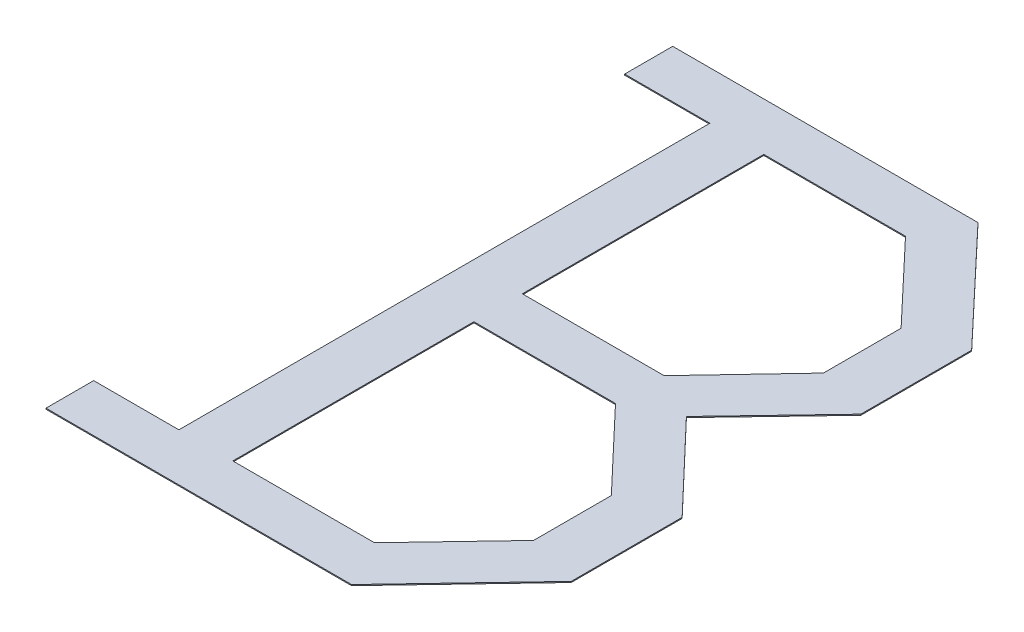
ISO-10303-21;
HEADER;
FILE_DESCRIPTION(('STEP AP214'),'2;1');
FILE_NAME('part.step','',(''),(''),'','','');
FILE_SCHEMA(('AUTOMOTIVE_DESIGN { 1 0 10303 214 1 1 1 1 }'));
ENDSEC;
DATA;
#1=APPLICATION_CONTEXT('core data for automotive mechanical design processes');
#2=APPLICATION_PROTOCOL_DEFINITION('international standard','automotive_design',2000,#1);
#3=PRODUCT_CONTEXT('',#1,'mechanical');
#4=PRODUCT('Part','Part','',(#3));
#5=PRODUCT_RELATED_PRODUCT_CATEGORY('part','',(#4));
#6=PRODUCT_DEFINITION_FORMATION('','',#4);
#7=PRODUCT_DEFINITION_CONTEXT('part definition',#1,'design');
#8=PRODUCT_DEFINITION('design','',#6,#7);
#9=PRODUCT_DEFINITION_SHAPE('','',#8);
#10=(LENGTH_UNIT() NAMED_UNIT(*) SI_UNIT(.MILLI.,.METRE.));
#11=(NAMED_UNIT(*) PLANE_ANGLE_UNIT() SI_UNIT($,.RADIAN.));
#12=(NAMED_UNIT(*) SI_UNIT($,.STERADIAN.) SOLID_ANGLE_UNIT());
#13=UNCERTAINTY_MEASURE_WITH_UNIT(LENGTH_MEASURE(1.E-05),#10,'distance_accuracy_value','');
#14=(GEOMETRIC_REPRESENTATION_CONTEXT(3) GLOBAL_UNCERTAINTY_ASSIGNED_CONTEXT((#13)) GLOBAL_UNIT_ASSIGNED_CONTEXT((#10,
#11,#12)) REPRESENTATION_CONTEXT('',''));
#15=CARTESIAN_POINT('',(0.,0.,0.));
#16=DIRECTION('',(0.,0.,1.));
#17=DIRECTION('',(1.,0.,0.));
#18=AXIS2_PLACEMENT_3D('',#15,#16,#17);
#19=CARTESIAN_POINT('',(0.,1.4,0.));
#20=DIRECTION('',(0.,-1.,0.));
#21=DIRECTION('',(0.,0.,-1.));
#22=AXIS2_PLACEMENT_3D('',#19,#20,#21);
#23=PLANE('',#22);
#24=DIRECTION('',(1.,0.,0.));
#25=VECTOR('',#24,1.);
#26=CARTESIAN_POINT('',(4.48324374001376,1.4,-0.881585544443215));
#27=LINE('',#26,#25);
#28=CARTESIAN_POINT('',(4.34227378124682,1.4,-0.881585544443215));
#29=VERTEX_POINT('',#28);
#30=CARTESIAN_POINT('',(4.48324374001376,1.4,-0.881585544443215));
#31=VERTEX_POINT('',#30);
#32=EDGE_CURVE('E242',#29,#31,#27,.T.);
#33=ORIENTED_EDGE('',*,*,#32,.F.);
#34=DIRECTION('',(0.,0.,-1.));
#35=VECTOR('',#34,1.);
#36=CARTESIAN_POINT('',(4.34227378124682,1.4,-0.881585544443215));
#37=LINE('',#36,#35);
#38=CARTESIAN_POINT('',(4.34227378124682,1.4,-0.641522713106085));
#39=VERTEX_POINT('',#38);
#40=EDGE_CURVE('E239',#39,#29,#37,.T.);
#41=ORIENTED_EDGE('',*,*,#40,.F.);
#42=DIRECTION('',(-1.,0.,0.));
#43=VECTOR('',#42,1.);
#44=CARTESIAN_POINT('',(4.34227378124682,1.4,-0.641522713106085));
#45=LINE('',#44,#43);
#46=CARTESIAN_POINT('',(4.48336547572945,1.4,-0.641522713106085));
#47=VERTEX_POINT('',#46);
#48=EDGE_CURVE('E236',#47,#39,#45,.T.);
#49=ORIENTED_EDGE('',*,*,#48,.F.);
#50=DIRECTION('',(-0.688949348904804,0.,0.724809488516566));
#51=VECTOR('',#50,1.);
#52=CARTESIAN_POINT('',(4.48336547572945,1.4,-0.641522713106085));
#53=LINE('',#52,#51);
#54=CARTESIAN_POINT('',(4.56054591947576,1.4,-0.722720435470108));
#55=VERTEX_POINT('',#54);
#56=EDGE_CURVE('E233',#55,#47,#53,.T.);
#57=ORIENTED_EDGE('',*,*,#56,.F.);
#58=DIRECTION('',(0.,0.,1.));
#59=VECTOR('',#58,1.);
#60=CARTESIAN_POINT('',(4.56054591947576,1.4,-0.722720435470114));
#61=LINE('',#60,#59);
#62=CARTESIAN_POINT('',(4.56054591947576,1.4,-0.800144350647809));
#63=VERTEX_POINT('',#62);
#64=EDGE_CURVE('E248',#63,#55,#61,.T.);
#65=ORIENTED_EDGE('',*,*,#64,.F.);
#66=DIRECTION('',(0.688435976725143,0.,0.725297115636412));
#67=VECTOR('',#66,1.);
#68=CARTESIAN_POINT('',(4.56054591947576,1.4,-0.800144350647809));
#69=LINE('',#68,#67);
#70=EDGE_CURVE('E245',#31,#63,#69,.T.);
#71=ORIENTED_EDGE('',*,*,#70,.F.);
#72=EDGE_LOOP('',(#33,#41,#49,#57,#65,#71));
#73=FACE_BOUND('',#72,.T.);
#74=DIRECTION('',(1.,0.,0.));
#75=VECTOR('',#74,1.);
#76=CARTESIAN_POINT('',(4.48336547572945,1.4,-1.17022092633994));
#77=LINE('',#76,#75);
#78=CARTESIAN_POINT('',(4.34227378124682,1.4,-1.17022092633994));
#79=VERTEX_POINT('',#78);
#80=CARTESIAN_POINT('',(4.48336547572944,1.4,-1.17022092633994));
#81=VERTEX_POINT('',#80);
#82=EDGE_CURVE('E223',#79,#81,#77,.T.);
#83=ORIENTED_EDGE('',*,*,#82,.F.);
#84=DIRECTION('',(0.,0.,-1.));
#85=VECTOR('',#84,1.);
#86=CARTESIAN_POINT('',(4.34227378124682,1.4,-1.17022092633994));
#87=LINE('',#86,#85);
#88=CARTESIAN_POINT('',(4.34227378124682,1.4,-0.929792887855742));
#89=VERTEX_POINT('',#88);
#90=EDGE_CURVE('E220',#89,#79,#87,.T.);
#91=ORIENTED_EDGE('',*,*,#90,.F.);
#92=DIRECTION('',(-1.,0.,0.));
#93=VECTOR('',#92,1.);
#94=CARTESIAN_POINT('',(4.34227378124682,1.4,-0.929792887855742));
#95=LINE('',#94,#93);
#96=CARTESIAN_POINT('',(4.48348721144513,1.4,-0.929792887855742));
#97=VERTEX_POINT('',#96);
#98=EDGE_CURVE('E217',#97,#89,#95,.T.);
#99=ORIENTED_EDGE('',*,*,#98,.F.);
#100=DIRECTION('',(-0.686750951212991,0.,0.726892791963198));
#101=VECTOR('',#100,1.);
#102=CARTESIAN_POINT('',(4.48348721144513,1.4,-0.929792887855742));
#103=LINE('',#102,#101);
#104=CARTESIAN_POINT('',(4.56054591947576,1.4,-1.01135581736684));
#105=VERTEX_POINT('',#104);
#106=EDGE_CURVE('E214',#105,#97,#103,.T.);
#107=ORIENTED_EDGE('',*,*,#106,.F.);
#108=DIRECTION('',(0.,0.,1.));
#109=VECTOR('',#108,1.);
#110=CARTESIAN_POINT('',(4.56054591947576,1.4,-1.01135581736684));
#111=LINE('',#110,#109);
#112=CARTESIAN_POINT('',(4.56054591947576,1.4,-1.08865799682884));
#113=VERTEX_POINT('',#112);
#114=EDGE_CURVE('E230',#113,#105,#111,.T.);
#115=ORIENTED_EDGE('',*,*,#114,.F.);
#116=DIRECTION('',(0.687323550750743,0.,0.726351386440056));
#117=VECTOR('',#116,1.);
#118=CARTESIAN_POINT('',(4.56054591947576,1.4,-1.08865799682884));
#119=LINE('',#118,#117);
#120=EDGE_CURVE('E226',#81,#113,#119,.T.);
#121=ORIENTED_EDGE('',*,*,#120,.F.);
#122=EDGE_LOOP('',(#83,#91,#99,#107,#115,#121));
#123=FACE_BOUND('',#122,.T.);
#124=DIRECTION('',(0.690569998309889,0.,-0.723265564944357));
#125=VECTOR('',#124,1.);
#126=CARTESIAN_POINT('',(4.61459657724133,1.4,-0.994556288601864));
#127=LINE('',#126,#125);
#128=CARTESIAN_POINT('',(4.52974678340665,1.4,-0.905689216149477));
#129=VERTEX_POINT('',#128);
#130=CARTESIAN_POINT('',(4.61459657724133,1.4,-0.994556288601864));
#131=VERTEX_POINT('',#130);
#132=EDGE_CURVE('E256',#129,#131,#127,.T.);
#133=ORIENTED_EDGE('',*,*,#132,.F.);
#134=DIRECTION('',(-0.689581055340307,0.,-0.724208511490819));
#135=VECTOR('',#134,1.);
#136=CARTESIAN_POINT('',(4.52974678340665,1.4,-0.905689216149478));
#137=LINE('',#136,#135);
#138=CARTESIAN_POINT('',(4.61459657724133,1.4,-0.816578672265714));
#139=VERTEX_POINT('',#138);
#140=EDGE_CURVE('E253',#139,#129,#137,.T.);
#141=ORIENTED_EDGE('',*,*,#140,.F.);
#142=DIRECTION('',(0.,0.,-1.));
#143=VECTOR('',#142,1.);
#144=CARTESIAN_POINT('',(4.61459657724133,1.4,-0.816578672265716));
#145=LINE('',#144,#143);
#146=CARTESIAN_POINT('',(4.61459657724133,1.4,-0.706164378136519));
#147=VERTEX_POINT('',#146);
#148=EDGE_CURVE('E191',#147,#139,#145,.T.);
#149=ORIENTED_EDGE('',*,*,#148,.F.);
#150=DIRECTION('',(0.689183543998156,0.,-0.724586808244631));
#151=VECTOR('',#150,1.);
#152=CARTESIAN_POINT('',(4.61459657724133,1.4,-0.706164378136519));
#153=LINE('',#152,#151);
#154=CARTESIAN_POINT('',(4.50795609029846,1.4,-0.594045783987688));
#155=VERTEX_POINT('',#154);
#156=EDGE_CURVE('E186',#155,#147,#153,.T.);
#157=ORIENTED_EDGE('',*,*,#156,.F.);
#158=DIRECTION('',(1.,0.,0.));
#159=VECTOR('',#158,1.);
#160=CARTESIAN_POINT('',(4.50795609029846,1.4,-0.594045783987688));
#161=LINE('',#160,#159);
#162=CARTESIAN_POINT('',(4.20373853679365,1.4,-0.594045783987688));
#163=VERTEX_POINT('',#162);
#164=EDGE_CURVE('E177',#163,#155,#161,.T.);
#165=ORIENTED_EDGE('',*,*,#164,.F.);
#166=DIRECTION('',(0.,0.,1.));
#167=VECTOR('',#166,1.);
#168=CARTESIAN_POINT('',(4.20373853679365,1.4,-0.594045783987688));
#169=LINE('',#168,#167);
#170=CARTESIAN_POINT('',(4.20373853679365,1.4,-0.641522713106085));
#171=VERTEX_POINT('',#170);
#172=EDGE_CURVE('E199',#171,#163,#169,.T.);
#173=ORIENTED_EDGE('',*,*,#172,.F.);
#174=DIRECTION('',(-1.,0.,0.));
#175=VECTOR('',#174,1.);
#176=CARTESIAN_POINT('',(4.20373853679365,1.4,-0.641522713106085));
#177=LINE('',#176,#175);
#178=CARTESIAN_POINT('',(4.28858833062833,1.4,-0.641522713106085));
#179=VERTEX_POINT('',#178);
#180=EDGE_CURVE('E203',#179,#171,#177,.T.);
#181=ORIENTED_EDGE('',*,*,#180,.F.);
#182=DIRECTION('',(0.,0.,1.));
#183=VECTOR('',#182,1.);
#184=CARTESIAN_POINT('',(4.28858833062833,1.4,-0.641522713106085));
#185=LINE('',#184,#183);
#186=CARTESIAN_POINT('',(4.28858833062833,1.4,-1.17022092633994));
#187=VERTEX_POINT('',#186);
#188=EDGE_CURVE('E274',#187,#179,#185,.T.);
#189=ORIENTED_EDGE('',*,*,#188,.F.);
#190=DIRECTION('',(1.,0.,0.));
#191=VECTOR('',#190,1.);
#192=CARTESIAN_POINT('',(4.28858833062833,1.4,-1.17022092633994));
#193=LINE('',#192,#191);
#194=CARTESIAN_POINT('',(4.20373853679365,1.4,-1.17022092633994));
#195=VERTEX_POINT('',#194);
#196=EDGE_CURVE('E271',#195,#187,#193,.T.);
#197=ORIENTED_EDGE('',*,*,#196,.F.);
#198=DIRECTION('',(0.,0.,1.));
#199=VECTOR('',#198,1.);
#200=CARTESIAN_POINT('',(4.20373853679365,1.4,-1.17022092633994));
#201=LINE('',#200,#199);
#202=CARTESIAN_POINT('',(4.20373853679365,1.4,-1.2180630626054));
#203=VERTEX_POINT('',#202);
#204=EDGE_CURVE('E268',#203,#195,#201,.T.);
#205=ORIENTED_EDGE('',*,*,#204,.F.);
#206=DIRECTION('',(-1.,0.,0.));
#207=VECTOR('',#206,1.);
#208=CARTESIAN_POINT('',(4.20373853679365,1.4,-1.2180630626054));
#209=LINE('',#208,#207);
#210=CARTESIAN_POINT('',(4.50771261886709,1.4,-1.2180630626054));
#211=VERTEX_POINT('',#210);
#212=EDGE_CURVE('E265',#211,#203,#209,.T.);
#213=ORIENTED_EDGE('',*,*,#212,.F.);
#214=DIRECTION('',(-0.686485767880143,0.,-0.727143239326345));
#215=VECTOR('',#214,1.);
#216=CARTESIAN_POINT('',(4.50771261886709,1.4,-1.2180630626054));
#217=LINE('',#216,#215);
#218=CARTESIAN_POINT('',(4.61459657724133,1.4,-1.10484884701537));
#219=VERTEX_POINT('',#218);
#220=EDGE_CURVE('E262',#219,#211,#217,.T.);
#221=ORIENTED_EDGE('',*,*,#220,.F.);
#222=DIRECTION('',(0.,0.,-1.));
#223=VECTOR('',#222,1.);
#224=CARTESIAN_POINT('',(4.61459657724133,1.4,-1.10484884701537));
#225=LINE('',#224,#223);
#226=EDGE_CURVE('E259',#131,#219,#225,.T.);
#227=ORIENTED_EDGE('',*,*,#226,.F.);
#228=EDGE_LOOP('',(#133,#141,#149,#157,#165,#173,#181,#189,#197,#205,#213,#221,#227));
#229=FACE_BOUND('',#228,.T.);
#230=ADVANCED_FACE('F16',(#73,#123,#229),#23,.T.);
#231=CARTESIAN_POINT('',(4.61459657724133,1.401,-0.706164378136519));
#232=DIRECTION('',(0.724586808244631,0.,0.689183543998156));
#233=DIRECTION('',(0.689183543998156,0.,-0.724586808244631));
#234=AXIS2_PLACEMENT_3D('',#231,#232,#233);
#235=PLANE('',#234);
#236=DIRECTION('',(-0.689183543998179,0.,0.724586808244609));
#237=VECTOR('',#236,1.);
#238=CARTESIAN_POINT('',(4.61459657724133,1.401,-0.706164378136519));
#239=LINE('',#238,#237);
#240=CARTESIAN_POINT('',(4.61459657724133,1.401,-0.706164378136519));
#241=VERTEX_POINT('',#240);
#242=CARTESIAN_POINT('',(4.50795609029846,1.401,-0.594045783987688));
#243=VERTEX_POINT('',#242);
#244=EDGE_CURVE('E198',#241,#243,#239,.T.);
#245=ORIENTED_EDGE('',*,*,#244,.T.);
#246=DIRECTION('',(0.,1.,0.));
#247=VECTOR('',#246,1.);
#248=CARTESIAN_POINT('',(4.50795609029846,1.401,-0.594045783987688));
#249=LINE('',#248,#247);
#250=EDGE_CURVE('E19',#155,#243,#249,.T.);
#251=ORIENTED_EDGE('',*,*,#250,.F.);
#252=ORIENTED_EDGE('',*,*,#156,.T.);
#253=DIRECTION('',(0.,1.,0.));
#254=VECTOR('',#253,1.);
#255=CARTESIAN_POINT('',(4.61459657724133,1.401,-0.706164378136519));
#256=LINE('',#255,#254);
#257=EDGE_CURVE('E246',#241,#147,#256,.F.);
#258=ORIENTED_EDGE('',*,*,#257,.F.);
#259=EDGE_LOOP('',(#245,#251,#252,#258));
#260=FACE_BOUND('',#259,.T.);
#261=ADVANCED_FACE('F197',(#260),#235,.T.);
#262=CARTESIAN_POINT('',(4.50795609029846,1.401,-0.594045783987688));
#263=DIRECTION('',(0.,0.,1.));
#264=DIRECTION('',(1.,0.,0.));
#265=AXIS2_PLACEMENT_3D('',#262,#263,#264);
#266=PLANE('',#265);
#267=DIRECTION('',(1.,0.,0.));
#268=VECTOR('',#267,1.);
#269=CARTESIAN_POINT('',(0.,1.401,-0.594045783987688));
#270=LINE('',#269,#268);
#271=CARTESIAN_POINT('',(4.20373853679365,1.401,-0.594045783987688));
#272=VERTEX_POINT('',#271);
#273=EDGE_CURVE('E208',#243,#272,#270,.F.);
#274=ORIENTED_EDGE('',*,*,#273,.T.);
#275=DIRECTION('',(0.,1.,0.));
#276=VECTOR('',#275,1.);
#277=CARTESIAN_POINT('',(4.20373853679365,1.401,-0.594045783987688));
#278=LINE('',#277,#276);
#279=EDGE_CURVE('E183',#163,#272,#278,.T.);
#280=ORIENTED_EDGE('',*,*,#279,.F.);
#281=ORIENTED_EDGE('',*,*,#164,.T.);
#282=ORIENTED_EDGE('',*,*,#250,.T.);
#283=EDGE_LOOP('',(#274,#280,#281,#282));
#284=FACE_BOUND('',#283,.T.);
#285=ADVANCED_FACE('F180',(#284),#266,.T.);
#286=CARTESIAN_POINT('',(4.20373853679365,1.401,-0.594045783987688));
#287=DIRECTION('',(-1.,0.,0.));
#288=DIRECTION('',(0.,0.,1.));
#289=AXIS2_PLACEMENT_3D('',#286,#287,#288);
#290=PLANE('',#289);
#291=DIRECTION('',(0.,0.,-1.));
#292=VECTOR('',#291,1.);
#293=CARTESIAN_POINT('',(4.20373853679365,1.401,0.));
#294=LINE('',#293,#292);
#295=CARTESIAN_POINT('',(4.20373853679365,1.401,-0.641522713106085));
#296=VERTEX_POINT('',#295);
#297=EDGE_CURVE('E206',#272,#296,#294,.T.);
#298=ORIENTED_EDGE('',*,*,#297,.T.);
#299=DIRECTION('',(0.,1.,0.));
#300=VECTOR('',#299,1.);
#301=CARTESIAN_POINT('',(4.20373853679365,1.401,-0.641522713106085));
#302=LINE('',#301,#300);
#303=EDGE_CURVE('E275',#171,#296,#302,.T.);
#304=ORIENTED_EDGE('',*,*,#303,.F.);
#305=ORIENTED_EDGE('',*,*,#172,.T.);
#306=ORIENTED_EDGE('',*,*,#279,.T.);
#307=EDGE_LOOP('',(#298,#304,#305,#306));
#308=FACE_BOUND('',#307,.T.);
#309=ADVANCED_FACE('F603',(#308),#290,.T.);
#310=CARTESIAN_POINT('',(4.20373853679365,1.401,-0.641522713106085));
#311=DIRECTION('',(0.,0.,-1.));
#312=DIRECTION('',(-1.,0.,0.));
#313=AXIS2_PLACEMENT_3D('',#310,#311,#312);
#314=PLANE('',#313);
#315=DIRECTION('',(1.,0.,0.));
#316=VECTOR('',#315,1.);
#317=CARTESIAN_POINT('',(0.,1.401,-0.641522713106085));
#318=LINE('',#317,#316);
#319=CARTESIAN_POINT('',(4.28858833062833,1.401,-0.641522713106085));
#320=VERTEX_POINT('',#319);
#321=EDGE_CURVE('E283',#296,#320,#318,.T.);
#322=ORIENTED_EDGE('',*,*,#321,.T.);
#323=DIRECTION('',(0.,1.,0.));
#324=VECTOR('',#323,1.);
#325=CARTESIAN_POINT('',(4.28858833062833,1.401,-0.641522713106085));
#326=LINE('',#325,#324);
#327=EDGE_CURVE('E272',#179,#320,#326,.T.);
#328=ORIENTED_EDGE('',*,*,#327,.F.);
#329=ORIENTED_EDGE('',*,*,#180,.T.);
#330=ORIENTED_EDGE('',*,*,#303,.T.);
#331=EDGE_LOOP('',(#322,#328,#329,#330));
#332=FACE_BOUND('',#331,.T.);
#333=ADVANCED_FACE('F594',(#332),#314,.T.);
#334=CARTESIAN_POINT('',(4.28858833062833,1.401,-0.641522713106085));
#335=DIRECTION('',(-1.,0.,0.));
#336=DIRECTION('',(0.,0.,1.));
#337=AXIS2_PLACEMENT_3D('',#334,#335,#336);
#338=PLANE('',#337);
#339=DIRECTION('',(0.,0.,-1.));
#340=VECTOR('',#339,1.);
#341=CARTESIAN_POINT('',(4.28858833062833,1.401,0.));
#342=LINE('',#341,#340);
#343=CARTESIAN_POINT('',(4.28858833062833,1.401,-1.17022092633994));
#344=VERTEX_POINT('',#343);
#345=EDGE_CURVE('E284',#320,#344,#342,.T.);
#346=ORIENTED_EDGE('',*,*,#345,.T.);
#347=DIRECTION('',(0.,1.,0.));
#348=VECTOR('',#347,1.);
#349=CARTESIAN_POINT('',(4.28858833062833,1.401,-1.17022092633994));
#350=LINE('',#349,#348);
#351=EDGE_CURVE('E269',#187,#344,#350,.T.);
#352=ORIENTED_EDGE('',*,*,#351,.F.);
#353=ORIENTED_EDGE('',*,*,#188,.T.);
#354=ORIENTED_EDGE('',*,*,#327,.T.);
#355=EDGE_LOOP('',(#346,#352,#353,#354));
#356=FACE_BOUND('',#355,.T.);
#357=ADVANCED_FACE('F585',(#356),#338,.T.);
#358=CARTESIAN_POINT('',(4.28858833062833,1.401,-1.17022092633994));
#359=DIRECTION('',(0.,0.,1.));
#360=DIRECTION('',(1.,0.,0.));
#361=AXIS2_PLACEMENT_3D('',#358,#359,#360);
#362=PLANE('',#361);
#363=DIRECTION('',(1.,0.,0.));
#364=VECTOR('',#363,1.);
#365=CARTESIAN_POINT('',(0.,1.401,-1.17022092633994));
#366=LINE('',#365,#364);
#367=CARTESIAN_POINT('',(4.20373853679365,1.401,-1.17022092633994));
#368=VERTEX_POINT('',#367);
#369=EDGE_CURVE('E288',#344,#368,#366,.F.);
#370=ORIENTED_EDGE('',*,*,#369,.T.);
#371=DIRECTION('',(0.,1.,0.));
#372=VECTOR('',#371,1.);
#373=CARTESIAN_POINT('',(4.20373853679365,1.401,-1.17022092633994));
#374=LINE('',#373,#372);
#375=EDGE_CURVE('E266',#195,#368,#374,.T.);
#376=ORIENTED_EDGE('',*,*,#375,.F.);
#377=ORIENTED_EDGE('',*,*,#196,.T.);
#378=ORIENTED_EDGE('',*,*,#351,.T.);
#379=EDGE_LOOP('',(#370,#376,#377,#378));
#380=FACE_BOUND('',#379,.T.);
#381=ADVANCED_FACE('F576',(#380),#362,.T.);
#382=CARTESIAN_POINT('',(4.20373853679365,1.401,-1.17022092633994));
#383=DIRECTION('',(-1.,0.,0.));
#384=DIRECTION('',(0.,0.,1.));
#385=AXIS2_PLACEMENT_3D('',#382,#383,#384);
#386=PLANE('',#385);
#387=DIRECTION('',(0.,0.,-1.));
#388=VECTOR('',#387,1.);
#389=CARTESIAN_POINT('',(4.20373853679365,1.401,0.));
#390=LINE('',#389,#388);
#391=CARTESIAN_POINT('',(4.20373853679365,1.401,-1.2180630626054));
#392=VERTEX_POINT('',#391);
#393=EDGE_CURVE('E292',#368,#392,#390,.T.);
#394=ORIENTED_EDGE('',*,*,#393,.T.);
#395=DIRECTION('',(0.,1.,0.));
#396=VECTOR('',#395,1.);
#397=CARTESIAN_POINT('',(4.20373853679365,1.401,-1.2180630626054));
#398=LINE('',#397,#396);
#399=EDGE_CURVE('E263',#203,#392,#398,.T.);
#400=ORIENTED_EDGE('',*,*,#399,.F.);
#401=ORIENTED_EDGE('',*,*,#204,.T.);
#402=ORIENTED_EDGE('',*,*,#375,.T.);
#403=EDGE_LOOP('',(#394,#400,#401,#402));
#404=FACE_BOUND('',#403,.T.);
#405=ADVANCED_FACE('F567',(#404),#386,.T.);
#406=CARTESIAN_POINT('',(4.20373853679365,1.401,-1.2180630626054));
#407=DIRECTION('',(0.,0.,-1.));
#408=DIRECTION('',(-1.,0.,0.));
#409=AXIS2_PLACEMENT_3D('',#406,#407,#408);
#410=PLANE('',#409);
#411=DIRECTION('',(1.,0.,0.));
#412=VECTOR('',#411,1.);
#413=CARTESIAN_POINT('',(0.,1.401,-1.2180630626054));
#414=LINE('',#413,#412);
#415=CARTESIAN_POINT('',(4.50771261886709,1.401,-1.2180630626054));
#416=VERTEX_POINT('',#415);
#417=EDGE_CURVE('E296',#392,#416,#414,.T.);
#418=ORIENTED_EDGE('',*,*,#417,.T.);
#419=DIRECTION('',(0.,1.,0.));
#420=VECTOR('',#419,1.);
#421=CARTESIAN_POINT('',(4.50771261886709,1.401,-1.2180630626054));
#422=LINE('',#421,#420);
#423=EDGE_CURVE('E260',#211,#416,#422,.T.);
#424=ORIENTED_EDGE('',*,*,#423,.F.);
#425=ORIENTED_EDGE('',*,*,#212,.T.);
#426=ORIENTED_EDGE('',*,*,#399,.T.);
#427=EDGE_LOOP('',(#418,#424,#425,#426));
#428=FACE_BOUND('',#427,.T.);
#429=ADVANCED_FACE('F558',(#428),#410,.T.);
#430=CARTESIAN_POINT('',(4.50771261886709,1.401,-1.2180630626054));
#431=DIRECTION('',(0.727143239326345,0.,-0.686485767880143));
#432=DIRECTION('',(-0.686485767880143,0.,-0.727143239326345));
#433=AXIS2_PLACEMENT_3D('',#430,#431,#432);
#434=PLANE('',#433);
#435=DIRECTION('',(0.686485767880129,0.,0.727143239326358));
#436=VECTOR('',#435,1.);
#437=CARTESIAN_POINT('',(4.50771261886709,1.401,-1.2180630626054));
#438=LINE('',#437,#436);
#439=CARTESIAN_POINT('',(4.61459657724133,1.401,-1.10484884701537));
#440=VERTEX_POINT('',#439);
#441=EDGE_CURVE('E300',#416,#440,#438,.T.);
#442=ORIENTED_EDGE('',*,*,#441,.T.);
#443=DIRECTION('',(0.,1.,0.));
#444=VECTOR('',#443,1.);
#445=CARTESIAN_POINT('',(4.61459657724133,1.401,-1.10484884701537));
#446=LINE('',#445,#444);
#447=EDGE_CURVE('E257',#219,#440,#446,.T.);
#448=ORIENTED_EDGE('',*,*,#447,.F.);
#449=ORIENTED_EDGE('',*,*,#220,.T.);
#450=ORIENTED_EDGE('',*,*,#423,.T.);
#451=EDGE_LOOP('',(#442,#448,#449,#450));
#452=FACE_BOUND('',#451,.T.);
#453=ADVANCED_FACE('F549',(#452),#434,.T.);
#454=CARTESIAN_POINT('',(4.61459657724133,1.401,-1.10484884701537));
#455=DIRECTION('',(1.,0.,0.));
#456=DIRECTION('',(0.,0.,-1.));
#457=AXIS2_PLACEMENT_3D('',#454,#455,#456);
#458=PLANE('',#457);
#459=DIRECTION('',(0.,0.,-1.));
#460=VECTOR('',#459,1.);
#461=CARTESIAN_POINT('',(4.61459657724133,1.401,0.));
#462=LINE('',#461,#460);
#463=CARTESIAN_POINT('',(4.61459657724133,1.401,-0.994556288601864));
#464=VERTEX_POINT('',#463);
#465=EDGE_CURVE('E304',#440,#464,#462,.F.);
#466=ORIENTED_EDGE('',*,*,#465,.T.);
#467=DIRECTION('',(0.,1.,0.));
#468=VECTOR('',#467,1.);
#469=CARTESIAN_POINT('',(4.61459657724133,1.401,-0.994556288601864));
#470=LINE('',#469,#468);
#471=EDGE_CURVE('E254',#131,#464,#470,.T.);
#472=ORIENTED_EDGE('',*,*,#471,.F.);
#473=ORIENTED_EDGE('',*,*,#226,.T.);
#474=ORIENTED_EDGE('',*,*,#447,.T.);
#475=EDGE_LOOP('',(#466,#472,#473,#474));
#476=FACE_BOUND('',#475,.T.);
#477=ADVANCED_FACE('F540',(#476),#458,.T.);
#478=CARTESIAN_POINT('',(4.61459657724133,1.401,-0.994556288601864));
#479=DIRECTION('',(0.723265564944357,0.,0.690569998309889));
#480=DIRECTION('',(0.690569998309889,0.,-0.723265564944357));
#481=AXIS2_PLACEMENT_3D('',#478,#479,#480);
#482=PLANE('',#481);
#483=DIRECTION('',(-0.690569998309907,0.,0.72326556494434));
#484=VECTOR('',#483,1.);
#485=CARTESIAN_POINT('',(4.61459657724133,1.401,-0.994556288601864));
#486=LINE('',#485,#484);
#487=CARTESIAN_POINT('',(4.52974678340665,1.401,-0.905689216149478));
#488=VERTEX_POINT('',#487);
#489=EDGE_CURVE('E308',#464,#488,#486,.T.);
#490=ORIENTED_EDGE('',*,*,#489,.T.);
#491=DIRECTION('',(0.,1.,0.));
#492=VECTOR('',#491,1.);
#493=CARTESIAN_POINT('',(4.52974678340665,1.401,-0.905689216149478));
#494=LINE('',#493,#492);
#495=EDGE_CURVE('E251',#129,#488,#494,.T.);
#496=ORIENTED_EDGE('',*,*,#495,.F.);
#497=ORIENTED_EDGE('',*,*,#132,.T.);
#498=ORIENTED_EDGE('',*,*,#471,.T.);
#499=EDGE_LOOP('',(#490,#496,#497,#498));
#500=FACE_BOUND('',#499,.T.);
#501=ADVANCED_FACE('F531',(#500),#482,.T.);
#502=CARTESIAN_POINT('',(4.52974678340665,1.401,-0.905689216149478));
#503=DIRECTION('',(0.724208511490819,0.,-0.689581055340307));
#504=DIRECTION('',(-0.689581055340307,0.,-0.724208511490819));
#505=AXIS2_PLACEMENT_3D('',#502,#503,#504);
#506=PLANE('',#505);
#507=DIRECTION('',(0.689581055340326,0.,0.724208511490801));
#508=VECTOR('',#507,1.);
#509=CARTESIAN_POINT('',(4.52974678340665,1.401,-0.905689216149478));
#510=LINE('',#509,#508);
#511=CARTESIAN_POINT('',(4.61459657724133,1.401,-0.816578672265716));
#512=VERTEX_POINT('',#511);
#513=EDGE_CURVE('E312',#488,#512,#510,.T.);
#514=ORIENTED_EDGE('',*,*,#513,.T.);
#515=DIRECTION('',(0.,1.,0.));
#516=VECTOR('',#515,1.);
#517=CARTESIAN_POINT('',(4.61459657724133,1.401,-0.816578672265716));
#518=LINE('',#517,#516);
#519=EDGE_CURVE('E249',#139,#512,#518,.T.);
#520=ORIENTED_EDGE('',*,*,#519,.F.);
#521=ORIENTED_EDGE('',*,*,#140,.T.);
#522=ORIENTED_EDGE('',*,*,#495,.T.);
#523=EDGE_LOOP('',(#514,#520,#521,#522));
#524=FACE_BOUND('',#523,.T.);
#525=ADVANCED_FACE('F522',(#524),#506,.T.);
#526=CARTESIAN_POINT('',(4.61459657724133,1.401,-0.816578672265716));
#527=DIRECTION('',(1.,0.,0.));
#528=DIRECTION('',(0.,0.,-1.));
#529=AXIS2_PLACEMENT_3D('',#526,#527,#528);
#530=PLANE('',#529);
#531=DIRECTION('',(0.,0.,-1.));
#532=VECTOR('',#531,1.);
#533=CARTESIAN_POINT('',(4.61459657724133,1.401,0.));
#534=LINE('',#533,#532);
#535=EDGE_CURVE('E315',#512,#241,#534,.F.);
#536=ORIENTED_EDGE('',*,*,#535,.T.);
#537=ORIENTED_EDGE('',*,*,#257,.T.);
#538=ORIENTED_EDGE('',*,*,#148,.T.);
#539=ORIENTED_EDGE('',*,*,#519,.T.);
#540=EDGE_LOOP('',(#536,#537,#538,#539));
#541=FACE_BOUND('',#540,.T.);
#542=ADVANCED_FACE('F513',(#541),#530,.T.);
#543=CARTESIAN_POINT('',(4.56054591947576,1.401,-0.722720435470114));
#544=DIRECTION('',(-1.,0.,0.));
#545=DIRECTION('',(0.,0.,1.));
#546=AXIS2_PLACEMENT_3D('',#543,#544,#545);
#547=PLANE('',#546);
#548=DIRECTION('',(0.,0.,-1.));
#549=VECTOR('',#548,1.);
#550=CARTESIAN_POINT('',(4.56054591947576,1.401,0.));
#551=LINE('',#550,#549);
#552=CARTESIAN_POINT('',(4.56054591947576,1.401,-0.722720435470112));
#553=VERTEX_POINT('',#552);
#554=CARTESIAN_POINT('',(4.56054591947576,1.401,-0.800144350647809));
#555=VERTEX_POINT('',#554);
#556=EDGE_CURVE('E318',#553,#555,#551,.T.);
#557=ORIENTED_EDGE('',*,*,#556,.T.);
#558=DIRECTION('',(0.,1.,0.));
#559=VECTOR('',#558,1.);
#560=CARTESIAN_POINT('',(4.56054591947576,1.401,-0.800144350647809));
#561=LINE('',#560,#559);
#562=EDGE_CURVE('E243',#63,#555,#561,.T.);
#563=ORIENTED_EDGE('',*,*,#562,.F.);
#564=ORIENTED_EDGE('',*,*,#64,.T.);
#565=DIRECTION('',(0.,1.,0.));
#566=VECTOR('',#565,1.);
#567=CARTESIAN_POINT('',(4.56054591947576,1.401,-0.72272043547011));
#568=LINE('',#567,#566);
#569=EDGE_CURVE('E227',#553,#55,#568,.F.);
#570=ORIENTED_EDGE('',*,*,#569,.F.);
#571=EDGE_LOOP('',(#557,#563,#564,#570));
#572=FACE_BOUND('',#571,.T.);
#573=ADVANCED_FACE('F504',(#572),#547,.T.);
#574=CARTESIAN_POINT('',(4.56054591947576,1.401,-0.800144350647809));
#575=DIRECTION('',(-0.725297115636412,0.,0.688435976725143));
#576=DIRECTION('',(0.688435976725143,0.,0.725297115636412));
#577=AXIS2_PLACEMENT_3D('',#574,#575,#576);
#578=PLANE('',#577);
#579=DIRECTION('',(-0.688435976725107,0.,-0.725297115636445));
#580=VECTOR('',#579,1.);
#581=CARTESIAN_POINT('',(4.56054591947576,1.401,-0.800144350647809));
#582=LINE('',#581,#580);
#583=CARTESIAN_POINT('',(4.48324374001376,1.401,-0.881585544443215));
#584=VERTEX_POINT('',#583);
#585=EDGE_CURVE('E324',#555,#584,#582,.T.);
#586=ORIENTED_EDGE('',*,*,#585,.T.);
#587=DIRECTION('',(0.,1.,0.));
#588=VECTOR('',#587,1.);
#589=CARTESIAN_POINT('',(4.48324374001376,1.401,-0.881585544443215));
#590=LINE('',#589,#588);
#591=EDGE_CURVE('E240',#31,#584,#590,.T.);
#592=ORIENTED_EDGE('',*,*,#591,.F.);
#593=ORIENTED_EDGE('',*,*,#70,.T.);
#594=ORIENTED_EDGE('',*,*,#562,.T.);
#595=EDGE_LOOP('',(#586,#592,#593,#594));
#596=FACE_BOUND('',#595,.T.);
#597=ADVANCED_FACE('F495',(#596),#578,.T.);
#598=CARTESIAN_POINT('',(4.48324374001376,1.401,-0.881585544443215));
#599=DIRECTION('',(0.,0.,1.));
#600=DIRECTION('',(1.,0.,0.));
#601=AXIS2_PLACEMENT_3D('',#598,#599,#600);
#602=PLANE('',#601);
#603=DIRECTION('',(1.,0.,0.));
#604=VECTOR('',#603,1.);
#605=CARTESIAN_POINT('',(0.,1.401,-0.881585544443215));
#606=LINE('',#605,#604);
#607=CARTESIAN_POINT('',(4.34227378124682,1.401,-0.881585544443215));
#608=VERTEX_POINT('',#607);
#609=EDGE_CURVE('E327',#584,#608,#606,.F.);
#610=ORIENTED_EDGE('',*,*,#609,.T.);
#611=DIRECTION('',(0.,1.,0.));
#612=VECTOR('',#611,1.);
#613=CARTESIAN_POINT('',(4.34227378124682,1.401,-0.881585544443215));
#614=LINE('',#613,#612);
#615=EDGE_CURVE('E237',#29,#608,#614,.T.);
#616=ORIENTED_EDGE('',*,*,#615,.F.);
#617=ORIENTED_EDGE('',*,*,#32,.T.);
#618=ORIENTED_EDGE('',*,*,#591,.T.);
#619=EDGE_LOOP('',(#610,#616,#617,#618));
#620=FACE_BOUND('',#619,.T.);
#621=ADVANCED_FACE('F486',(#620),#602,.T.);
#622=CARTESIAN_POINT('',(4.34227378124682,1.401,-0.881585544443215));
#623=DIRECTION('',(1.,0.,0.));
#624=DIRECTION('',(0.,0.,-1.));
#625=AXIS2_PLACEMENT_3D('',#622,#623,#624);
#626=PLANE('',#625);
#627=DIRECTION('',(0.,0.,-1.));
#628=VECTOR('',#627,1.);
#629=CARTESIAN_POINT('',(4.34227378124682,1.401,0.));
#630=LINE('',#629,#628);
#631=CARTESIAN_POINT('',(4.34227378124682,1.401,-0.641522713106085));
#632=VERTEX_POINT('',#631);
#633=EDGE_CURVE('E331',#608,#632,#630,.F.);
#634=ORIENTED_EDGE('',*,*,#633,.T.);
#635=DIRECTION('',(0.,1.,0.));
#636=VECTOR('',#635,1.);
#637=CARTESIAN_POINT('',(4.34227378124682,1.401,-0.641522713106085));
#638=LINE('',#637,#636);
#639=EDGE_CURVE('E234',#39,#632,#638,.T.);
#640=ORIENTED_EDGE('',*,*,#639,.F.);
#641=ORIENTED_EDGE('',*,*,#40,.T.);
#642=ORIENTED_EDGE('',*,*,#615,.T.);
#643=EDGE_LOOP('',(#634,#640,#641,#642));
#644=FACE_BOUND('',#643,.T.);
#645=ADVANCED_FACE('F477',(#644),#626,.T.);
#646=CARTESIAN_POINT('',(4.34227378124682,1.401,-0.641522713106085));
#647=DIRECTION('',(0.,0.,-1.));
#648=DIRECTION('',(-1.,0.,0.));
#649=AXIS2_PLACEMENT_3D('',#646,#647,#648);
#650=PLANE('',#649);
#651=DIRECTION('',(1.,0.,0.));
#652=VECTOR('',#651,1.);
#653=CARTESIAN_POINT('',(0.,1.401,-0.641522713106085));
#654=LINE('',#653,#652);
#655=CARTESIAN_POINT('',(4.48336547572945,1.401,-0.641522713106085));
#656=VERTEX_POINT('',#655);
#657=EDGE_CURVE('E335',#632,#656,#654,.T.);
#658=ORIENTED_EDGE('',*,*,#657,.T.);
#659=DIRECTION('',(0.,1.,0.));
#660=VECTOR('',#659,1.);
#661=CARTESIAN_POINT('',(4.48336547572945,1.401,-0.641522713106085));
#662=LINE('',#661,#660);
#663=EDGE_CURVE('E231',#47,#656,#662,.T.);
#664=ORIENTED_EDGE('',*,*,#663,.F.);
#665=ORIENTED_EDGE('',*,*,#48,.T.);
#666=ORIENTED_EDGE('',*,*,#639,.T.);
#667=EDGE_LOOP('',(#658,#664,#665,#666));
#668=FACE_BOUND('',#667,.T.);
#669=ADVANCED_FACE('F406',(#668),#650,.T.);
#670=CARTESIAN_POINT('',(4.48336547572945,1.401,-0.641522713106085));
#671=DIRECTION('',(-0.724809488516566,0.,-0.688949348904804));
#672=DIRECTION('',(-0.688949348904804,0.,0.724809488516566));
#673=AXIS2_PLACEMENT_3D('',#670,#671,#672);
#674=PLANE('',#673);
#675=DIRECTION('',(0.688949348904768,0.,-0.7248094885166));
#676=VECTOR('',#675,1.);
#677=CARTESIAN_POINT('',(4.48336547572945,1.401,-0.641522713106085));
#678=LINE('',#677,#676);
#679=EDGE_CURVE('E339',#656,#553,#678,.T.);
#680=ORIENTED_EDGE('',*,*,#679,.T.);
#681=ORIENTED_EDGE('',*,*,#569,.T.);
#682=ORIENTED_EDGE('',*,*,#56,.T.);
#683=ORIENTED_EDGE('',*,*,#663,.T.);
#684=EDGE_LOOP('',(#680,#681,#682,#683));
#685=FACE_BOUND('',#684,.T.);
#686=ADVANCED_FACE('F398',(#685),#674,.T.);
#687=CARTESIAN_POINT('',(4.56054591947576,1.401,-1.01135581736684));
#688=DIRECTION('',(-1.,0.,0.));
#689=DIRECTION('',(0.,0.,1.));
#690=AXIS2_PLACEMENT_3D('',#687,#688,#689);
#691=PLANE('',#690);
#692=DIRECTION('',(0.,0.,-1.));
#693=VECTOR('',#692,1.);
#694=CARTESIAN_POINT('',(4.56054591947576,1.401,0.));
#695=LINE('',#694,#693);
#696=CARTESIAN_POINT('',(4.56054591947576,1.401,-1.01135581736684));
#697=VERTEX_POINT('',#696);
#698=CARTESIAN_POINT('',(4.56054591947576,1.401,-1.08865799682884));
#699=VERTEX_POINT('',#698);
#700=EDGE_CURVE('E342',#697,#699,#695,.T.);
#701=ORIENTED_EDGE('',*,*,#700,.T.);
#702=DIRECTION('',(0.,1.,0.));
#703=VECTOR('',#702,1.);
#704=CARTESIAN_POINT('',(4.56054591947576,1.401,-1.08865799682884));
#705=LINE('',#704,#703);
#706=EDGE_CURVE('E224',#113,#699,#705,.T.);
#707=ORIENTED_EDGE('',*,*,#706,.F.);
#708=ORIENTED_EDGE('',*,*,#114,.T.);
#709=DIRECTION('',(0.,1.,0.));
#710=VECTOR('',#709,1.);
#711=CARTESIAN_POINT('',(4.56054591947576,1.401,-1.01135581736684));
#712=LINE('',#711,#710);
#713=EDGE_CURVE('E210',#697,#105,#712,.F.);
#714=ORIENTED_EDGE('',*,*,#713,.F.);
#715=EDGE_LOOP('',(#701,#707,#708,#714));
#716=FACE_BOUND('',#715,.T.);
#717=ADVANCED_FACE('F395',(#716),#691,.T.);
#718=CARTESIAN_POINT('',(4.56054591947576,1.401,-1.08865799682884));
#719=DIRECTION('',(-0.726351386440056,0.,0.687323550750743));
#720=DIRECTION('',(0.687323550750743,0.,0.726351386440056));
#721=AXIS2_PLACEMENT_3D('',#718,#719,#720);
#722=PLANE('',#721);
#723=DIRECTION('',(-0.687323550750678,0.,-0.726351386440117));
#724=VECTOR('',#723,1.);
#725=CARTESIAN_POINT('',(4.56054591947576,1.401,-1.08865799682884));
#726=LINE('',#725,#724);
#727=CARTESIAN_POINT('',(4.48336547572945,1.401,-1.17022092633994));
#728=VERTEX_POINT('',#727);
#729=EDGE_CURVE('E349',#699,#728,#726,.T.);
#730=ORIENTED_EDGE('',*,*,#729,.T.);
#731=DIRECTION('',(0.,1.,0.));
#732=VECTOR('',#731,1.);
#733=CARTESIAN_POINT('',(4.48336547572945,1.401,-1.17022092633994));
#734=LINE('',#733,#732);
#735=EDGE_CURVE('E221',#81,#728,#734,.T.);
#736=ORIENTED_EDGE('',*,*,#735,.F.);
#737=ORIENTED_EDGE('',*,*,#120,.T.);
#738=ORIENTED_EDGE('',*,*,#706,.T.);
#739=EDGE_LOOP('',(#730,#736,#737,#738));
#740=FACE_BOUND('',#739,.T.);
#741=ADVANCED_FACE('F392',(#740),#722,.T.);
#742=CARTESIAN_POINT('',(4.48336547572945,1.401,-1.17022092633994));
#743=DIRECTION('',(0.,0.,1.));
#744=DIRECTION('',(1.,0.,0.));
#745=AXIS2_PLACEMENT_3D('',#742,#743,#744);
#746=PLANE('',#745);
#747=DIRECTION('',(1.,0.,0.));
#748=VECTOR('',#747,1.);
#749=CARTESIAN_POINT('',(0.,1.401,-1.17022092633994));
#750=LINE('',#749,#748);
#751=CARTESIAN_POINT('',(4.34227378124682,1.401,-1.17022092633994));
#752=VERTEX_POINT('',#751);
#753=EDGE_CURVE('E352',#728,#752,#750,.F.);
#754=ORIENTED_EDGE('',*,*,#753,.T.);
#755=DIRECTION('',(0.,1.,0.));
#756=VECTOR('',#755,1.);
#757=CARTESIAN_POINT('',(4.34227378124682,1.401,-1.17022092633994));
#758=LINE('',#757,#756);
#759=EDGE_CURVE('E218',#79,#752,#758,.T.);
#760=ORIENTED_EDGE('',*,*,#759,.F.);
#761=ORIENTED_EDGE('',*,*,#82,.T.);
#762=ORIENTED_EDGE('',*,*,#735,.T.);
#763=EDGE_LOOP('',(#754,#760,#761,#762));
#764=FACE_BOUND('',#763,.T.);
#765=ADVANCED_FACE('F387',(#764),#746,.T.);
#766=CARTESIAN_POINT('',(4.34227378124682,1.401,-1.17022092633994));
#767=DIRECTION('',(1.,0.,0.));
#768=DIRECTION('',(0.,0.,-1.));
#769=AXIS2_PLACEMENT_3D('',#766,#767,#768);
#770=PLANE('',#769);
#771=DIRECTION('',(0.,0.,-1.));
#772=VECTOR('',#771,1.);
#773=CARTESIAN_POINT('',(4.34227378124682,1.401,0.));
#774=LINE('',#773,#772);
#775=CARTESIAN_POINT('',(4.34227378124682,1.401,-0.929792887855742));
#776=VERTEX_POINT('',#775);
#777=EDGE_CURVE('E356',#752,#776,#774,.F.);
#778=ORIENTED_EDGE('',*,*,#777,.T.);
#779=DIRECTION('',(0.,1.,0.));
#780=VECTOR('',#779,1.);
#781=CARTESIAN_POINT('',(4.34227378124682,1.401,-0.929792887855742));
#782=LINE('',#781,#780);
#783=EDGE_CURVE('E215',#89,#776,#782,.T.);
#784=ORIENTED_EDGE('',*,*,#783,.F.);
#785=ORIENTED_EDGE('',*,*,#90,.T.);
#786=ORIENTED_EDGE('',*,*,#759,.T.);
#787=EDGE_LOOP('',(#778,#784,#785,#786));
#788=FACE_BOUND('',#787,.T.);
#789=ADVANCED_FACE('F384',(#788),#770,.T.);
#790=CARTESIAN_POINT('',(4.34227378124682,1.401,-0.929792887855742));
#791=DIRECTION('',(0.,0.,-1.));
#792=DIRECTION('',(-1.,0.,0.));
#793=AXIS2_PLACEMENT_3D('',#790,#791,#792);
#794=PLANE('',#793);
#795=DIRECTION('',(1.,0.,0.));
#796=VECTOR('',#795,1.);
#797=CARTESIAN_POINT('',(0.,1.401,-0.929792887855742));
#798=LINE('',#797,#796);
#799=CARTESIAN_POINT('',(4.48348721144513,1.401,-0.929792887855742));
#800=VERTEX_POINT('',#799);
#801=EDGE_CURVE('E25',#776,#800,#798,.T.);
#802=ORIENTED_EDGE('',*,*,#801,.T.);
#803=DIRECTION('',(0.,1.,0.));
#804=VECTOR('',#803,1.);
#805=CARTESIAN_POINT('',(4.48348721144513,1.401,-0.929792887855742));
#806=LINE('',#805,#804);
#807=EDGE_CURVE('E33',#97,#800,#806,.T.);
#808=ORIENTED_EDGE('',*,*,#807,.F.);
#809=ORIENTED_EDGE('',*,*,#98,.T.);
#810=ORIENTED_EDGE('',*,*,#783,.T.);
#811=EDGE_LOOP('',(#802,#808,#809,#810));
#812=FACE_BOUND('',#811,.T.);
#813=ADVANCED_FACE('F375',(#812),#794,.T.);
#814=CARTESIAN_POINT('',(4.48348721144513,1.401,-0.929792887855742));
#815=DIRECTION('',(-0.726892791963198,0.,-0.686750951212991));
#816=DIRECTION('',(-0.686750951212991,0.,0.726892791963198));
#817=AXIS2_PLACEMENT_3D('',#814,#815,#816);
#818=PLANE('',#817);
#819=DIRECTION('',(0.686750951212971,0.,-0.726892791963216));
#820=VECTOR('',#819,1.);
#821=CARTESIAN_POINT('',(4.48348721144513,1.401,-0.929792887855742));
#822=LINE('',#821,#820);
#823=EDGE_CURVE('E11',#800,#697,#822,.T.);
#824=ORIENTED_EDGE('',*,*,#823,.T.);
#825=ORIENTED_EDGE('',*,*,#713,.T.);
#826=ORIENTED_EDGE('',*,*,#106,.T.);
#827=ORIENTED_EDGE('',*,*,#807,.T.);
#828=EDGE_LOOP('',(#824,#825,#826,#827));
#829=FACE_BOUND('',#828,.T.);
#830=ADVANCED_FACE('F367',(#829),#818,.T.);
#831=CARTESIAN_POINT('',(0.,1.401,0.));
#832=DIRECTION('',(0.,-1.,0.));
#833=DIRECTION('',(0.,0.,-1.));
#834=AXIS2_PLACEMENT_3D('',#831,#832,#833);
#835=PLANE('',#834);
#836=ORIENTED_EDGE('',*,*,#801,.F.);
#837=ORIENTED_EDGE('',*,*,#777,.F.);
#838=ORIENTED_EDGE('',*,*,#753,.F.);
#839=ORIENTED_EDGE('',*,*,#729,.F.);
#840=ORIENTED_EDGE('',*,*,#700,.F.);
#841=ORIENTED_EDGE('',*,*,#823,.F.);
#842=EDGE_LOOP('',(#836,#837,#838,#839,#840,#841));
#843=FACE_BOUND('',#842,.T.);
#844=ORIENTED_EDGE('',*,*,#657,.F.);
#845=ORIENTED_EDGE('',*,*,#633,.F.);
#846=ORIENTED_EDGE('',*,*,#609,.F.);
#847=ORIENTED_EDGE('',*,*,#585,.F.);
#848=ORIENTED_EDGE('',*,*,#556,.F.);
#849=ORIENTED_EDGE('',*,*,#679,.F.);
#850=EDGE_LOOP('',(#844,#845,#846,#847,#848,#849));
#851=FACE_BOUND('',#850,.T.);
#852=ORIENTED_EDGE('',*,*,#513,.F.);
#853=ORIENTED_EDGE('',*,*,#489,.F.);
#854=ORIENTED_EDGE('',*,*,#465,.F.);
#855=ORIENTED_EDGE('',*,*,#441,.F.);
#856=ORIENTED_EDGE('',*,*,#417,.F.);
#857=ORIENTED_EDGE('',*,*,#393,.F.);
#858=ORIENTED_EDGE('',*,*,#369,.F.);
#859=ORIENTED_EDGE('',*,*,#345,.F.);
#860=ORIENTED_EDGE('',*,*,#321,.F.);
#861=ORIENTED_EDGE('',*,*,#297,.F.);
#862=ORIENTED_EDGE('',*,*,#273,.F.);
#863=ORIENTED_EDGE('',*,*,#244,.F.);
#864=ORIENTED_EDGE('',*,*,#535,.F.);
#865=EDGE_LOOP('',(#852,#853,#854,#855,#856,#857,#858,#859,#860,#861,#862,#863,#864));
#866=FACE_BOUND('',#865,.T.);
#867=ADVANCED_FACE('F379',(#843,#851,#866),#835,.F.);
#868=CLOSED_SHELL('',(#230,#261,#285,#309,#333,#357,#381,#405,#429,#453,#477,#501,#525,#542,
#573,#597,#621,#645,#669,#686,#717,#741,#765,#789,#813,#830,#867));
#869=MANIFOLD_SOLID_BREP('B1',#868);
#870=ADVANCED_BREP_SHAPE_REPRESENTATION('',(#18,#869),#14);
#871=SHAPE_DEFINITION_REPRESENTATION(#9,#870);
ENDSEC;
END-ISO-10303-21;
